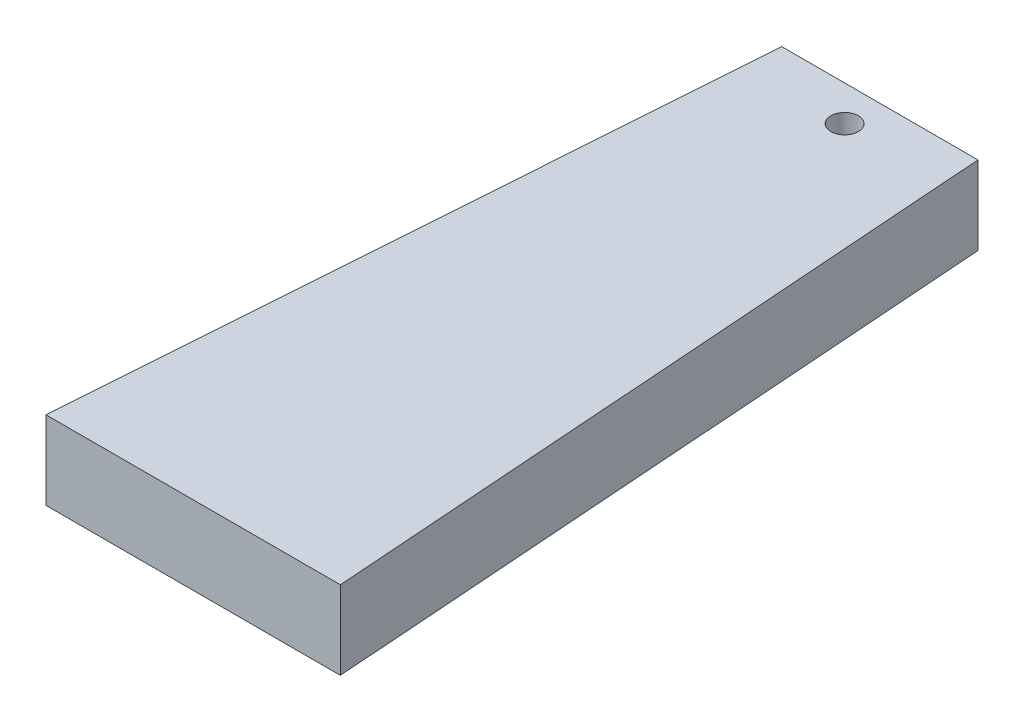
ISO-10303-21;
HEADER;
FILE_DESCRIPTION(('STEP AP214'),'2;1');
FILE_NAME('part.step','',(''),(''),'','','');
FILE_SCHEMA(('AUTOMOTIVE_DESIGN { 1 0 10303 214 1 1 1 1 }'));
ENDSEC;
DATA;
#1=APPLICATION_CONTEXT('core data for automotive mechanical design processes');
#2=APPLICATION_PROTOCOL_DEFINITION('international standard','automotive_design',2000,#1);
#3=PRODUCT_CONTEXT('',#1,'mechanical');
#4=PRODUCT('Part','Part','',(#3));
#5=PRODUCT_RELATED_PRODUCT_CATEGORY('part','',(#4));
#6=PRODUCT_DEFINITION_FORMATION('','',#4);
#7=PRODUCT_DEFINITION_CONTEXT('part definition',#1,'design');
#8=PRODUCT_DEFINITION('design','',#6,#7);
#9=PRODUCT_DEFINITION_SHAPE('','',#8);
#10=(LENGTH_UNIT() NAMED_UNIT(*) SI_UNIT(.MILLI.,.METRE.));
#11=(NAMED_UNIT(*) PLANE_ANGLE_UNIT() SI_UNIT($,.RADIAN.));
#12=(NAMED_UNIT(*) SI_UNIT($,.STERADIAN.) SOLID_ANGLE_UNIT());
#13=UNCERTAINTY_MEASURE_WITH_UNIT(LENGTH_MEASURE(1.E-05),#10,'distance_accuracy_value','');
#14=(GEOMETRIC_REPRESENTATION_CONTEXT(3) GLOBAL_UNCERTAINTY_ASSIGNED_CONTEXT((#13)) GLOBAL_UNIT_ASSIGNED_CONTEXT((#10,
#11,#12)) REPRESENTATION_CONTEXT('',''));
#15=CARTESIAN_POINT('',(0.,0.,0.));
#16=DIRECTION('',(0.,0.,1.));
#17=DIRECTION('',(1.,0.,0.));
#18=AXIS2_PLACEMENT_3D('',#15,#16,#17);
#19=CARTESIAN_POINT('',(15.,4.,70.));
#20=DIRECTION('',(0.,-1.,0.));
#21=DIRECTION('',(1.,0.,0.));
#22=AXIS2_PLACEMENT_3D('',#19,#20,#21);
#23=PLANE('',#22);
#24=CARTESIAN_POINT('',(0.,4.,3.6));
#25=DIRECTION('',(0.,1.,0.));
#26=DIRECTION('',(-1.,0.,0.));
#27=AXIS2_PLACEMENT_3D('',#24,#25,#26);
#28=CIRCLE('',#27,1.4);
#29=CARTESIAN_POINT('',(-1.4,4.,3.6));
#30=VERTEX_POINT('',#29);
#31=EDGE_CURVE('E109',#30,#30,#28,.T.);
#32=ORIENTED_EDGE('',*,*,#31,.F.);
#33=EDGE_LOOP('',(#32));
#34=FACE_BOUND('',#33,.T.);
#35=DIRECTION('',(-1.,0.,0.));
#36=VECTOR('',#35,1.);
#37=CARTESIAN_POINT('',(15.,4.,0.));
#38=LINE('',#37,#36);
#39=CARTESIAN_POINT('',(9.99999999999999,4.,0.));
#40=VERTEX_POINT('',#39);
#41=CARTESIAN_POINT('',(-10.,4.,0.));
#42=VERTEX_POINT('',#41);
#43=EDGE_CURVE('E87',#40,#42,#38,.T.);
#44=ORIENTED_EDGE('',*,*,#43,.T.);
#45=DIRECTION('',(0.0712470499879096,0.,-0.997458699830735));
#46=VECTOR('',#45,1.);
#47=CARTESIAN_POINT('',(-10.,4.,0.));
#48=LINE('',#47,#46);
#49=CARTESIAN_POINT('',(-15.,4.,70.));
#50=VERTEX_POINT('',#49);
#51=EDGE_CURVE('E47',#50,#42,#48,.T.);
#52=ORIENTED_EDGE('',*,*,#51,.F.);
#53=DIRECTION('',(-1.,0.,0.));
#54=VECTOR('',#53,1.);
#55=CARTESIAN_POINT('',(15.,4.,70.));
#56=LINE('',#55,#54);
#57=CARTESIAN_POINT('',(15.,4.,70.));
#58=VERTEX_POINT('',#57);
#59=EDGE_CURVE('E79',#58,#50,#56,.T.);
#60=ORIENTED_EDGE('',*,*,#59,.F.);
#61=DIRECTION('',(0.0712470499879096,0.,0.997458699830735));
#62=VECTOR('',#61,1.);
#63=CARTESIAN_POINT('',(9.99999999999999,4.,0.));
#64=LINE('',#63,#62);
#65=EDGE_CURVE('E88',#40,#58,#64,.T.);
#66=ORIENTED_EDGE('',*,*,#65,.F.);
#67=EDGE_LOOP('',(#44,#52,#60,#66));
#68=FACE_BOUND('',#67,.T.);
#69=ADVANCED_FACE('F32',(#34,#68),#23,.F.);
#70=CARTESIAN_POINT('',(15.,-4.,70.));
#71=DIRECTION('',(0.,-1.,0.));
#72=DIRECTION('',(1.,0.,0.));
#73=AXIS2_PLACEMENT_3D('',#70,#71,#72);
#74=PLANE('',#73);
#75=CARTESIAN_POINT('',(0.,-4.,3.6));
#76=DIRECTION('',(0.,-1.,0.));
#77=DIRECTION('',(1.,0.,0.));
#78=AXIS2_PLACEMENT_3D('',#75,#76,#77);
#79=CIRCLE('',#78,1.4);
#80=CARTESIAN_POINT('',(1.4,-4.,3.6));
#81=VERTEX_POINT('',#80);
#82=EDGE_CURVE('E35',#81,#81,#79,.T.);
#83=ORIENTED_EDGE('',*,*,#82,.F.);
#84=EDGE_LOOP('',(#83));
#85=FACE_BOUND('',#84,.T.);
#86=DIRECTION('',(-0.0712470499879096,0.,0.997458699830735));
#87=VECTOR('',#86,1.);
#88=CARTESIAN_POINT('',(-14.8477157360406,-4.,67.8680203045685));
#89=LINE('',#88,#87);
#90=CARTESIAN_POINT('',(-10.,-4.,0.));
#91=VERTEX_POINT('',#90);
#92=CARTESIAN_POINT('',(-15.,-4.,70.));
#93=VERTEX_POINT('',#92);
#94=EDGE_CURVE('E73',#91,#93,#89,.T.);
#95=ORIENTED_EDGE('',*,*,#94,.F.);
#96=DIRECTION('',(-1.,0.,0.));
#97=VECTOR('',#96,1.);
#98=CARTESIAN_POINT('',(15.,-4.,0.));
#99=LINE('',#98,#97);
#100=CARTESIAN_POINT('',(9.99999999999999,-4.,0.));
#101=VERTEX_POINT('',#100);
#102=EDGE_CURVE('E93',#101,#91,#99,.T.);
#103=ORIENTED_EDGE('',*,*,#102,.F.);
#104=DIRECTION('',(-0.0712470499879096,0.,-0.997458699830735));
#105=VECTOR('',#104,1.);
#106=CARTESIAN_POINT('',(15.,-4.,70.));
#107=LINE('',#106,#105);
#108=CARTESIAN_POINT('',(15.,-4.,70.));
#109=VERTEX_POINT('',#108);
#110=EDGE_CURVE('E54',#109,#101,#107,.T.);
#111=ORIENTED_EDGE('',*,*,#110,.F.);
#112=DIRECTION('',(-1.,0.,0.));
#113=VECTOR('',#112,1.);
#114=CARTESIAN_POINT('',(15.,-4.,70.));
#115=LINE('',#114,#113);
#116=EDGE_CURVE('E78',#109,#93,#115,.T.);
#117=ORIENTED_EDGE('',*,*,#116,.T.);
#118=EDGE_LOOP('',(#95,#103,#111,#117));
#119=FACE_BOUND('',#118,.T.);
#120=ADVANCED_FACE('F105',(#85,#119),#74,.T.);
#121=CARTESIAN_POINT('',(0.,0.,70.));
#122=DIRECTION('',(0.,0.,1.));
#123=DIRECTION('',(1.,0.,0.));
#124=AXIS2_PLACEMENT_3D('',#121,#122,#123);
#125=PLANE('',#124);
#126=DIRECTION('',(0.,1.,0.));
#127=VECTOR('',#126,1.);
#128=CARTESIAN_POINT('',(15.,-4.,70.));
#129=LINE('',#128,#127);
#130=EDGE_CURVE('E91',#109,#58,#129,.T.);
#131=ORIENTED_EDGE('',*,*,#130,.T.);
#132=ORIENTED_EDGE('',*,*,#59,.T.);
#133=DIRECTION('',(0.,1.,0.));
#134=VECTOR('',#133,1.);
#135=CARTESIAN_POINT('',(-15.,-4.,70.));
#136=LINE('',#135,#134);
#137=EDGE_CURVE('E70',#93,#50,#136,.T.);
#138=ORIENTED_EDGE('',*,*,#137,.F.);
#139=ORIENTED_EDGE('',*,*,#116,.F.);
#140=EDGE_LOOP('',(#131,#132,#138,#139));
#141=FACE_BOUND('',#140,.T.);
#142=ADVANCED_FACE('F90',(#141),#125,.T.);
#143=CARTESIAN_POINT('',(0.,0.,0.));
#144=DIRECTION('',(0.,0.,1.));
#145=DIRECTION('',(1.,0.,0.));
#146=AXIS2_PLACEMENT_3D('',#143,#144,#145);
#147=PLANE('',#146);
#148=ORIENTED_EDGE('',*,*,#102,.T.);
#149=DIRECTION('',(0.,1.,0.));
#150=VECTOR('',#149,1.);
#151=CARTESIAN_POINT('',(-10.,0.,0.));
#152=LINE('',#151,#150);
#153=EDGE_CURVE('E11',#91,#42,#152,.T.);
#154=ORIENTED_EDGE('',*,*,#153,.T.);
#155=ORIENTED_EDGE('',*,*,#43,.F.);
#156=DIRECTION('',(0.,-1.,0.));
#157=VECTOR('',#156,1.);
#158=CARTESIAN_POINT('',(9.99999999999999,0.,0.));
#159=LINE('',#158,#157);
#160=EDGE_CURVE('E40',#40,#101,#159,.T.);
#161=ORIENTED_EDGE('',*,*,#160,.T.);
#162=EDGE_LOOP('',(#148,#154,#155,#161));
#163=FACE_BOUND('',#162,.T.);
#164=ADVANCED_FACE('F103',(#163),#147,.F.);
#165=CARTESIAN_POINT('',(10.,-66.,0.));
#166=DIRECTION('',(-0.997458699830735,0.,0.0712470499879096));
#167=DIRECTION('',(0.0712470499879096,0.,0.997458699830735));
#168=AXIS2_PLACEMENT_3D('',#165,#166,#167);
#169=PLANE('',#168);
#170=ORIENTED_EDGE('',*,*,#110,.T.);
#171=ORIENTED_EDGE('',*,*,#160,.F.);
#172=ORIENTED_EDGE('',*,*,#65,.T.);
#173=ORIENTED_EDGE('',*,*,#130,.F.);
#174=EDGE_LOOP('',(#170,#171,#172,#173));
#175=FACE_BOUND('',#174,.T.);
#176=ADVANCED_FACE('F127',(#175),#169,.F.);
#177=CARTESIAN_POINT('',(-10.,-66.,0.));
#178=DIRECTION('',(0.997458699830735,0.,0.0712470499879096));
#179=DIRECTION('',(0.0712470499879096,0.,-0.997458699830735));
#180=AXIS2_PLACEMENT_3D('',#177,#178,#179);
#181=PLANE('',#180);
#182=ORIENTED_EDGE('',*,*,#94,.T.);
#183=ORIENTED_EDGE('',*,*,#137,.T.);
#184=ORIENTED_EDGE('',*,*,#51,.T.);
#185=ORIENTED_EDGE('',*,*,#153,.F.);
#186=EDGE_LOOP('',(#182,#183,#184,#185));
#187=FACE_BOUND('',#186,.T.);
#188=ADVANCED_FACE('F71',(#187),#181,.F.);
#189=CARTESIAN_POINT('',(0.,-96.,3.6));
#190=DIRECTION('',(0.,1.,0.));
#191=DIRECTION('',(-1.,0.,0.));
#192=AXIS2_PLACEMENT_3D('',#189,#190,#191);
#193=CYLINDRICAL_SURFACE('',#192,1.4);
#194=ORIENTED_EDGE('',*,*,#82,.T.);
#195=EDGE_LOOP('',(#194));
#196=FACE_BOUND('',#195,.T.);
#197=ORIENTED_EDGE('',*,*,#31,.T.);
#198=EDGE_LOOP('',(#197));
#199=FACE_BOUND('',#198,.T.);
#200=ADVANCED_FACE('F116',(#196,#199),#193,.F.);
#201=CLOSED_SHELL('',(#69,#120,#142,#164,#176,#188,#200));
#202=MANIFOLD_SOLID_BREP('B2',#201);
#203=ADVANCED_BREP_SHAPE_REPRESENTATION('',(#18,#202),#14);
#204=SHAPE_DEFINITION_REPRESENTATION(#9,#203);
ENDSEC;
END-ISO-10303-21;
